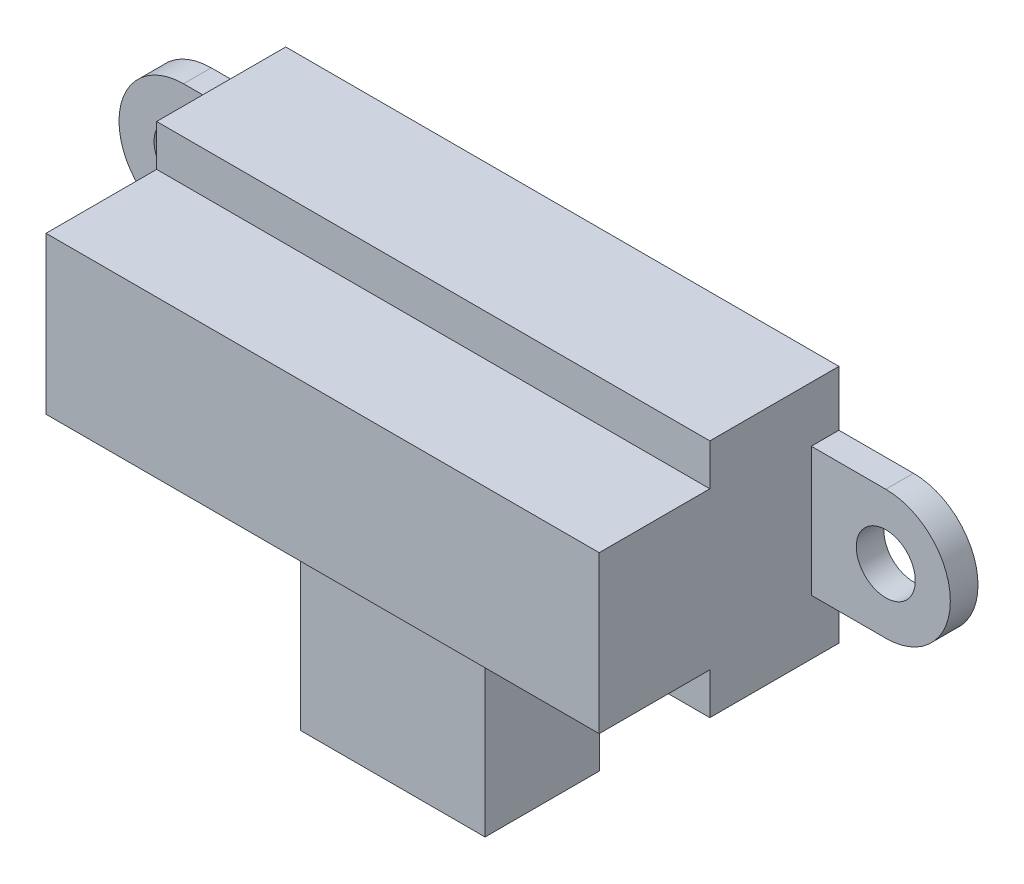
ISO-10303-21;
HEADER;
FILE_DESCRIPTION(('STEP AP214'),'2;1');
FILE_NAME('part.step','',(''),(''),'','','');
FILE_SCHEMA(('AUTOMOTIVE_DESIGN { 1 0 10303 214 1 1 1 1 }'));
ENDSEC;
DATA;
#1=APPLICATION_CONTEXT('core data for automotive mechanical design processes');
#2=APPLICATION_PROTOCOL_DEFINITION('international standard','automotive_design',2000,#1);
#3=PRODUCT_CONTEXT('',#1,'mechanical');
#4=PRODUCT('Part','Part','',(#3));
#5=PRODUCT_RELATED_PRODUCT_CATEGORY('part','',(#4));
#6=PRODUCT_DEFINITION_FORMATION('','',#4);
#7=PRODUCT_DEFINITION_CONTEXT('part definition',#1,'design');
#8=PRODUCT_DEFINITION('design','',#6,#7);
#9=PRODUCT_DEFINITION_SHAPE('','',#8);
#10=(LENGTH_UNIT() NAMED_UNIT(*) SI_UNIT(.MILLI.,.METRE.));
#11=(NAMED_UNIT(*) PLANE_ANGLE_UNIT() SI_UNIT($,.RADIAN.));
#12=(NAMED_UNIT(*) SI_UNIT($,.STERADIAN.) SOLID_ANGLE_UNIT());
#13=UNCERTAINTY_MEASURE_WITH_UNIT(LENGTH_MEASURE(1.E-05),#10,'distance_accuracy_value','');
#14=(GEOMETRIC_REPRESENTATION_CONTEXT(3) GLOBAL_UNCERTAINTY_ASSIGNED_CONTEXT((#13)) GLOBAL_UNIT_ASSIGNED_CONTEXT((#10,
#11,#12)) REPRESENTATION_CONTEXT('',''));
#15=CARTESIAN_POINT('',(0.,0.,0.));
#16=DIRECTION('',(0.,0.,1.));
#17=DIRECTION('',(1.,0.,0.));
#18=AXIS2_PLACEMENT_3D('',#15,#16,#17);
#19=CARTESIAN_POINT('',(3.7294903718985,-13.8810858102408,7.));
#20=DIRECTION('',(0.,0.,1.));
#21=DIRECTION('',(1.,0.,0.));
#22=AXIS2_PLACEMENT_3D('',#19,#20,#21);
#23=PLANE('',#22);
#24=DIRECTION('',(0.,-1.,0.));
#25=VECTOR('',#24,1.);
#26=CARTESIAN_POINT('',(9.51032870766269,-13.8810858102408,7.));
#27=LINE('',#26,#25);
#28=CARTESIAN_POINT('',(9.51032870766269,2.25,7.));
#29=VERTEX_POINT('',#28);
#30=CARTESIAN_POINT('',(9.51032870766269,0.,7.));
#31=VERTEX_POINT('',#30);
#32=EDGE_CURVE('E219',#29,#31,#27,.T.);
#33=ORIENTED_EDGE('',*,*,#32,.F.);
#34=DIRECTION('',(1.,0.,0.));
#35=VECTOR('',#34,1.);
#36=CARTESIAN_POINT('',(0.,2.25,7.));
#37=LINE('',#36,#35);
#38=CARTESIAN_POINT('',(0.,2.25,7.));
#39=VERTEX_POINT('',#38);
#40=EDGE_CURVE('E240',#39,#29,#37,.T.);
#41=ORIENTED_EDGE('',*,*,#40,.F.);
#42=DIRECTION('',(0.,1.,0.));
#43=VECTOR('',#42,1.);
#44=CARTESIAN_POINT('',(0.,-13.8810858102408,7.));
#45=LINE('',#44,#43);
#46=CARTESIAN_POINT('',(0.,0.,7.));
#47=VERTEX_POINT('',#46);
#48=EDGE_CURVE('E265',#47,#39,#45,.T.);
#49=ORIENTED_EDGE('',*,*,#48,.F.);
#50=DIRECTION('',(1.,0.,0.));
#51=VECTOR('',#50,1.);
#52=CARTESIAN_POINT('',(3.7294903718985,0.,7.));
#53=LINE('',#52,#51);
#54=EDGE_CURVE('E264',#47,#31,#53,.T.);
#55=ORIENTED_EDGE('',*,*,#54,.T.);
#56=EDGE_LOOP('',(#33,#41,#49,#55));
#57=FACE_BOUND('',#56,.T.);
#58=ADVANCED_FACE('F33',(#57),#23,.T.);
#59=DIRECTION('',(-1.,0.,0.));
#60=VECTOR('',#59,1.);
#61=CARTESIAN_POINT('',(0.,10.75,7.));
#62=LINE('',#61,#60);
#63=CARTESIAN_POINT('',(30.,10.75,7.));
#64=VERTEX_POINT('',#63);
#65=CARTESIAN_POINT('',(0.,10.75,7.));
#66=VERTEX_POINT('',#65);
#67=EDGE_CURVE('E227',#64,#66,#62,.T.);
#68=ORIENTED_EDGE('',*,*,#67,.F.);
#69=DIRECTION('',(0.,1.,0.));
#70=VECTOR('',#69,1.);
#71=CARTESIAN_POINT('',(30.,-13.8810858102408,7.));
#72=LINE('',#71,#70);
#73=CARTESIAN_POINT('',(30.,13.,7.));
#74=VERTEX_POINT('',#73);
#75=EDGE_CURVE('E285',#64,#74,#72,.T.);
#76=ORIENTED_EDGE('',*,*,#75,.T.);
#77=DIRECTION('',(1.,0.,0.));
#78=VECTOR('',#77,1.);
#79=CARTESIAN_POINT('',(3.7294903718985,13.,7.));
#80=LINE('',#79,#78);
#81=CARTESIAN_POINT('',(0.,13.,7.));
#82=VERTEX_POINT('',#81);
#83=EDGE_CURVE('E267',#82,#74,#80,.T.);
#84=ORIENTED_EDGE('',*,*,#83,.F.);
#85=EDGE_CURVE('E56',#66,#82,#45,.T.);
#86=ORIENTED_EDGE('',*,*,#85,.F.);
#87=EDGE_LOOP('',(#68,#76,#84,#86));
#88=FACE_BOUND('',#87,.T.);
#89=ADVANCED_FACE('F403',(#88),#23,.T.);
#90=CARTESIAN_POINT('',(30.,-13.8810858102408,7.));
#91=DIRECTION('',(-1.,0.,0.));
#92=DIRECTION('',(0.,-1.,0.));
#93=AXIS2_PLACEMENT_3D('',#90,#91,#92);
#94=PLANE('',#93);
#95=DIRECTION('',(0.,0.,-1.));
#96=VECTOR('',#95,1.);
#97=CARTESIAN_POINT('',(30.,3.,1.5));
#98=LINE('',#97,#96);
#99=CARTESIAN_POINT('',(30.,3.,1.5));
#100=VERTEX_POINT('',#99);
#101=CARTESIAN_POINT('',(30.,3.,0.));
#102=VERTEX_POINT('',#101);
#103=EDGE_CURVE('E714',#100,#102,#98,.T.);
#104=ORIENTED_EDGE('',*,*,#103,.F.);
#105=DIRECTION('',(0.,-1.,0.));
#106=VECTOR('',#105,1.);
#107=CARTESIAN_POINT('',(30.,-13.8810858102408,1.5));
#108=LINE('',#107,#106);
#109=CARTESIAN_POINT('',(30.,10.,1.5));
#110=VERTEX_POINT('',#109);
#111=EDGE_CURVE('E708',#110,#100,#108,.T.);
#112=ORIENTED_EDGE('',*,*,#111,.F.);
#113=DIRECTION('',(0.,0.,-1.));
#114=VECTOR('',#113,1.);
#115=CARTESIAN_POINT('',(30.,10.,1.5));
#116=LINE('',#115,#114);
#117=CARTESIAN_POINT('',(30.,10.,0.));
#118=VERTEX_POINT('',#117);
#119=EDGE_CURVE('E712',#110,#118,#116,.T.);
#120=ORIENTED_EDGE('',*,*,#119,.T.);
#121=DIRECTION('',(0.,1.,0.));
#122=VECTOR('',#121,1.);
#123=CARTESIAN_POINT('',(30.,-13.8810858102408,0.));
#124=LINE('',#123,#122);
#125=CARTESIAN_POINT('',(30.,13.,0.));
#126=VERTEX_POINT('',#125);
#127=EDGE_CURVE('E303',#118,#126,#124,.T.);
#128=ORIENTED_EDGE('',*,*,#127,.T.);
#129=DIRECTION('',(0.,0.,-1.));
#130=VECTOR('',#129,1.);
#131=CARTESIAN_POINT('',(30.,13.,7.));
#132=LINE('',#131,#130);
#133=EDGE_CURVE('E299',#74,#126,#132,.T.);
#134=ORIENTED_EDGE('',*,*,#133,.F.);
#135=ORIENTED_EDGE('',*,*,#75,.F.);
#136=DIRECTION('',(0.,0.,-1.));
#137=VECTOR('',#136,1.);
#138=CARTESIAN_POINT('',(30.,10.75,13.));
#139=LINE('',#138,#137);
#140=CARTESIAN_POINT('',(30.,10.75,13.));
#141=VERTEX_POINT('',#140);
#142=EDGE_CURVE('E430',#141,#64,#139,.T.);
#143=ORIENTED_EDGE('',*,*,#142,.F.);
#144=DIRECTION('',(0.,1.,0.));
#145=VECTOR('',#144,1.);
#146=CARTESIAN_POINT('',(30.,10.75,13.));
#147=LINE('',#146,#145);
#148=CARTESIAN_POINT('',(30.,2.25,13.));
#149=VERTEX_POINT('',#148);
#150=EDGE_CURVE('E229',#149,#141,#147,.T.);
#151=ORIENTED_EDGE('',*,*,#150,.F.);
#152=DIRECTION('',(0.,0.,-1.));
#153=VECTOR('',#152,1.);
#154=CARTESIAN_POINT('',(30.,2.25,13.));
#155=LINE('',#154,#153);
#156=CARTESIAN_POINT('',(30.,2.25,7.));
#157=VERTEX_POINT('',#156);
#158=EDGE_CURVE('E427',#149,#157,#155,.T.);
#159=ORIENTED_EDGE('',*,*,#158,.T.);
#160=CARTESIAN_POINT('',(30.,0.,7.));
#161=VERTEX_POINT('',#160);
#162=EDGE_CURVE('E288',#161,#157,#72,.T.);
#163=ORIENTED_EDGE('',*,*,#162,.F.);
#164=DIRECTION('',(0.,0.,-1.));
#165=VECTOR('',#164,1.);
#166=CARTESIAN_POINT('',(30.,0.,7.));
#167=LINE('',#166,#165);
#168=CARTESIAN_POINT('',(30.,0.,0.));
#169=VERTEX_POINT('',#168);
#170=EDGE_CURVE('E382',#161,#169,#167,.T.);
#171=ORIENTED_EDGE('',*,*,#170,.T.);
#172=EDGE_CURVE('E289',#169,#102,#124,.T.);
#173=ORIENTED_EDGE('',*,*,#172,.T.);
#174=EDGE_LOOP('',(#104,#112,#120,#128,#134,#135,#143,#151,#159,#163,#171,#173));
#175=FACE_BOUND('',#174,.T.);
#176=ADVANCED_FACE('F409',(#175),#94,.F.);
#177=CARTESIAN_POINT('',(3.7294903718985,0.,7.));
#178=DIRECTION('',(0.,1.,0.));
#179=DIRECTION('',(0.,0.,1.));
#180=AXIS2_PLACEMENT_3D('',#177,#178,#179);
#181=PLANE('',#180);
#182=DIRECTION('',(-1.,0.,0.));
#183=VECTOR('',#182,1.);
#184=CARTESIAN_POINT('',(3.7294903718985,0.,2.5));
#185=LINE('',#184,#183);
#186=CARTESIAN_POINT('',(19.5103287076627,0.,2.5));
#187=VERTEX_POINT('',#186);
#188=CARTESIAN_POINT('',(9.51032870766269,0.,2.5));
#189=VERTEX_POINT('',#188);
#190=EDGE_CURVE('E11',#187,#189,#185,.T.);
#191=ORIENTED_EDGE('',*,*,#190,.T.);
#192=DIRECTION('',(0.,0.,1.));
#193=VECTOR('',#192,1.);
#194=CARTESIAN_POINT('',(9.51032870766269,0.,7.));
#195=LINE('',#194,#193);
#196=EDGE_CURVE('E189',#189,#31,#195,.T.);
#197=ORIENTED_EDGE('',*,*,#196,.T.);
#198=ORIENTED_EDGE('',*,*,#54,.F.);
#199=DIRECTION('',(0.,0.,-1.));
#200=VECTOR('',#199,1.);
#201=CARTESIAN_POINT('',(0.,0.,7.));
#202=LINE('',#201,#200);
#203=CARTESIAN_POINT('',(0.,0.,0.));
#204=VERTEX_POINT('',#203);
#205=EDGE_CURVE('E284',#47,#204,#202,.T.);
#206=ORIENTED_EDGE('',*,*,#205,.T.);
#207=DIRECTION('',(1.,0.,0.));
#208=VECTOR('',#207,1.);
#209=CARTESIAN_POINT('',(3.7294903718985,0.,0.));
#210=LINE('',#209,#208);
#211=EDGE_CURVE('E279',#204,#169,#210,.T.);
#212=ORIENTED_EDGE('',*,*,#211,.T.);
#213=ORIENTED_EDGE('',*,*,#170,.F.);
#214=CARTESIAN_POINT('',(19.5103287076627,0.,7.));
#215=VERTEX_POINT('',#214);
#216=EDGE_CURVE('E268',#215,#161,#53,.T.);
#217=ORIENTED_EDGE('',*,*,#216,.F.);
#218=DIRECTION('',(0.,0.,-1.));
#219=VECTOR('',#218,1.);
#220=CARTESIAN_POINT('',(19.5103287076627,0.,7.));
#221=LINE('',#220,#219);
#222=EDGE_CURVE('E216',#215,#187,#221,.T.);
#223=ORIENTED_EDGE('',*,*,#222,.T.);
#224=EDGE_LOOP('',(#191,#197,#198,#206,#212,#213,#217,#223));
#225=FACE_BOUND('',#224,.T.);
#226=ADVANCED_FACE('F35',(#225),#181,.F.);
#227=CARTESIAN_POINT('',(3.7294903718985,13.,7.));
#228=DIRECTION('',(0.,1.,0.));
#229=DIRECTION('',(0.,0.,1.));
#230=AXIS2_PLACEMENT_3D('',#227,#228,#229);
#231=PLANE('',#230);
#232=DIRECTION('',(1.,0.,0.));
#233=VECTOR('',#232,1.);
#234=CARTESIAN_POINT('',(3.7294903718985,13.,0.));
#235=LINE('',#234,#233);
#236=CARTESIAN_POINT('',(0.,13.,0.));
#237=VERTEX_POINT('',#236);
#238=EDGE_CURVE('E337',#237,#126,#235,.T.);
#239=ORIENTED_EDGE('',*,*,#238,.F.);
#240=DIRECTION('',(0.,0.,-1.));
#241=VECTOR('',#240,1.);
#242=CARTESIAN_POINT('',(0.,13.,7.));
#243=LINE('',#242,#241);
#244=EDGE_CURVE('E251',#82,#237,#243,.T.);
#245=ORIENTED_EDGE('',*,*,#244,.F.);
#246=ORIENTED_EDGE('',*,*,#83,.T.);
#247=ORIENTED_EDGE('',*,*,#133,.T.);
#248=EDGE_LOOP('',(#239,#245,#246,#247));
#249=FACE_BOUND('',#248,.T.);
#250=ADVANCED_FACE('F418',(#249),#231,.T.);
#251=CARTESIAN_POINT('',(0.,-13.8810858102408,7.));
#252=DIRECTION('',(-1.,0.,0.));
#253=DIRECTION('',(0.,-1.,0.));
#254=AXIS2_PLACEMENT_3D('',#251,#252,#253);
#255=PLANE('',#254);
#256=DIRECTION('',(0.,0.,-1.));
#257=VECTOR('',#256,1.);
#258=CARTESIAN_POINT('',(0.,10.,1.5));
#259=LINE('',#258,#257);
#260=CARTESIAN_POINT('',(0.,10.,1.5));
#261=VERTEX_POINT('',#260);
#262=CARTESIAN_POINT('',(0.,10.,0.));
#263=VERTEX_POINT('',#262);
#264=EDGE_CURVE('E317',#261,#263,#259,.T.);
#265=ORIENTED_EDGE('',*,*,#264,.F.);
#266=DIRECTION('',(0.,-1.,0.));
#267=VECTOR('',#266,1.);
#268=CARTESIAN_POINT('',(0.,-13.8810858102408,1.5));
#269=LINE('',#268,#267);
#270=CARTESIAN_POINT('',(0.,3.,1.5));
#271=VERTEX_POINT('',#270);
#272=EDGE_CURVE('E320',#261,#271,#269,.T.);
#273=ORIENTED_EDGE('',*,*,#272,.T.);
#274=DIRECTION('',(0.,0.,-1.));
#275=VECTOR('',#274,1.);
#276=CARTESIAN_POINT('',(0.,3.,1.5));
#277=LINE('',#276,#275);
#278=CARTESIAN_POINT('',(0.,3.,0.));
#279=VERTEX_POINT('',#278);
#280=EDGE_CURVE('E319',#271,#279,#277,.T.);
#281=ORIENTED_EDGE('',*,*,#280,.T.);
#282=DIRECTION('',(0.,1.,0.));
#283=VECTOR('',#282,1.);
#284=CARTESIAN_POINT('',(0.,-13.8810858102408,0.));
#285=LINE('',#284,#283);
#286=EDGE_CURVE('E272',#204,#279,#285,.T.);
#287=ORIENTED_EDGE('',*,*,#286,.F.);
#288=ORIENTED_EDGE('',*,*,#205,.F.);
#289=ORIENTED_EDGE('',*,*,#48,.T.);
#290=DIRECTION('',(0.,0.,-1.));
#291=VECTOR('',#290,1.);
#292=CARTESIAN_POINT('',(0.,2.25,13.));
#293=LINE('',#292,#291);
#294=CARTESIAN_POINT('',(0.,2.25,13.));
#295=VERTEX_POINT('',#294);
#296=EDGE_CURVE('E429',#295,#39,#293,.T.);
#297=ORIENTED_EDGE('',*,*,#296,.F.);
#298=DIRECTION('',(0.,-1.,0.));
#299=VECTOR('',#298,1.);
#300=CARTESIAN_POINT('',(0.,10.75,13.));
#301=LINE('',#300,#299);
#302=CARTESIAN_POINT('',(0.,10.75,13.));
#303=VERTEX_POINT('',#302);
#304=EDGE_CURVE('E223',#303,#295,#301,.T.);
#305=ORIENTED_EDGE('',*,*,#304,.F.);
#306=DIRECTION('',(0.,0.,-1.));
#307=VECTOR('',#306,1.);
#308=CARTESIAN_POINT('',(0.,10.75,13.));
#309=LINE('',#308,#307);
#310=EDGE_CURVE('E233',#303,#66,#309,.T.);
#311=ORIENTED_EDGE('',*,*,#310,.T.);
#312=ORIENTED_EDGE('',*,*,#85,.T.);
#313=ORIENTED_EDGE('',*,*,#244,.T.);
#314=EDGE_CURVE('E342',#263,#237,#285,.T.);
#315=ORIENTED_EDGE('',*,*,#314,.F.);
#316=EDGE_LOOP('',(#265,#273,#281,#287,#288,#289,#297,#305,#311,#312,#313,#315));
#317=FACE_BOUND('',#316,.T.);
#318=ADVANCED_FACE('F365',(#317),#255,.T.);
#319=DIRECTION('',(0.,1.,0.));
#320=VECTOR('',#319,1.);
#321=CARTESIAN_POINT('',(19.5103287076627,-13.8810858102408,7.));
#322=LINE('',#321,#320);
#323=CARTESIAN_POINT('',(19.5103287076627,2.25,7.));
#324=VERTEX_POINT('',#323);
#325=EDGE_CURVE('E48',#215,#324,#322,.T.);
#326=ORIENTED_EDGE('',*,*,#325,.F.);
#327=ORIENTED_EDGE('',*,*,#216,.T.);
#328=ORIENTED_EDGE('',*,*,#162,.T.);
#329=EDGE_CURVE('E222',#324,#157,#37,.T.);
#330=ORIENTED_EDGE('',*,*,#329,.F.);
#331=EDGE_LOOP('',(#326,#327,#328,#330));
#332=FACE_BOUND('',#331,.T.);
#333=ADVANCED_FACE('F405',(#332),#23,.T.);
#334=CARTESIAN_POINT('',(3.7294903718985,-13.8810858102408,0.));
#335=DIRECTION('',(0.,0.,1.));
#336=DIRECTION('',(1.,0.,0.));
#337=AXIS2_PLACEMENT_3D('',#334,#335,#336);
#338=PLANE('',#337);
#339=ORIENTED_EDGE('',*,*,#211,.F.);
#340=ORIENTED_EDGE('',*,*,#286,.T.);
#341=DIRECTION('',(-1.,0.,0.));
#342=VECTOR('',#341,1.);
#343=CARTESIAN_POINT('',(3.7294903718985,3.,0.));
#344=LINE('',#343,#342);
#345=CARTESIAN_POINT('',(-4.041019256203,3.,0.));
#346=VERTEX_POINT('',#345);
#347=EDGE_CURVE('E371',#279,#346,#344,.T.);
#348=ORIENTED_EDGE('',*,*,#347,.T.);
#349=CARTESIAN_POINT('',(-4.041019256203,6.5,0.));
#350=DIRECTION('',(0.,0.,1.));
#351=DIRECTION('',(1.,0.,0.));
#352=AXIS2_PLACEMENT_3D('',#349,#350,#351);
#353=CIRCLE('',#352,3.5);
#354=CARTESIAN_POINT('',(-4.041019256203,10.,0.));
#355=VERTEX_POINT('',#354);
#356=EDGE_CURVE('E313',#355,#346,#353,.T.);
#357=ORIENTED_EDGE('',*,*,#356,.F.);
#358=DIRECTION('',(-1.,0.,0.));
#359=VECTOR('',#358,1.);
#360=CARTESIAN_POINT('',(3.7294903718985,10.,0.));
#361=LINE('',#360,#359);
#362=EDGE_CURVE('E310',#263,#355,#361,.T.);
#363=ORIENTED_EDGE('',*,*,#362,.F.);
#364=ORIENTED_EDGE('',*,*,#314,.T.);
#365=ORIENTED_EDGE('',*,*,#238,.T.);
#366=ORIENTED_EDGE('',*,*,#127,.F.);
#367=DIRECTION('',(1.,0.,0.));
#368=VECTOR('',#367,1.);
#369=CARTESIAN_POINT('',(26.2705096281015,10.,0.));
#370=LINE('',#369,#368);
#371=CARTESIAN_POINT('',(34.041019256203,10.,0.));
#372=VERTEX_POINT('',#371);
#373=EDGE_CURVE('E723',#118,#372,#370,.T.);
#374=ORIENTED_EDGE('',*,*,#373,.T.);
#375=CARTESIAN_POINT('',(34.041019256203,6.5,0.));
#376=DIRECTION('',(0.,0.,-1.));
#377=DIRECTION('',(-1.,0.,0.));
#378=AXIS2_PLACEMENT_3D('',#375,#376,#377);
#379=CIRCLE('',#378,3.5);
#380=CARTESIAN_POINT('',(34.041019256203,3.,0.));
#381=VERTEX_POINT('',#380);
#382=EDGE_CURVE('E724',#372,#381,#379,.T.);
#383=ORIENTED_EDGE('',*,*,#382,.T.);
#384=DIRECTION('',(1.,0.,0.));
#385=VECTOR('',#384,1.);
#386=CARTESIAN_POINT('',(26.2705096281015,3.,0.));
#387=LINE('',#386,#385);
#388=EDGE_CURVE('E727',#102,#381,#387,.T.);
#389=ORIENTED_EDGE('',*,*,#388,.F.);
#390=ORIENTED_EDGE('',*,*,#172,.F.);
#391=EDGE_LOOP('',(#339,#340,#348,#357,#363,#364,#365,#366,#374,#383,#389,#390));
#392=FACE_BOUND('',#391,.T.);
#393=CARTESIAN_POINT('',(-4.041019256203,6.5,0.));
#394=DIRECTION('',(0.,0.,1.));
#395=DIRECTION('',(1.,0.,0.));
#396=AXIS2_PLACEMENT_3D('',#393,#394,#395);
#397=CIRCLE('',#396,1.6);
#398=CARTESIAN_POINT('',(-2.441019256203,6.5,0.));
#399=VERTEX_POINT('',#398);
#400=EDGE_CURVE('E314',#399,#399,#397,.T.);
#401=ORIENTED_EDGE('',*,*,#400,.T.);
#402=EDGE_LOOP('',(#401));
#403=FACE_BOUND('',#402,.T.);
#404=CARTESIAN_POINT('',(34.041019256203,6.5,0.));
#405=DIRECTION('',(0.,0.,-1.));
#406=DIRECTION('',(-1.,0.,0.));
#407=AXIS2_PLACEMENT_3D('',#404,#405,#406);
#408=CIRCLE('',#407,1.6);
#409=CARTESIAN_POINT('',(32.441019256203,6.5,0.));
#410=VERTEX_POINT('',#409);
#411=EDGE_CURVE('E431',#410,#410,#408,.T.);
#412=ORIENTED_EDGE('',*,*,#411,.F.);
#413=EDGE_LOOP('',(#412));
#414=FACE_BOUND('',#413,.T.);
#415=ADVANCED_FACE('F361',(#392,#403,#414),#338,.F.);
#416=CARTESIAN_POINT('',(3.7294903718985,10.,1.5));
#417=DIRECTION('',(0.,-1.,0.));
#418=DIRECTION('',(0.,0.,-1.));
#419=AXIS2_PLACEMENT_3D('',#416,#417,#418);
#420=PLANE('',#419);
#421=ORIENTED_EDGE('',*,*,#362,.T.);
#422=DIRECTION('',(0.,0.,-1.));
#423=VECTOR('',#422,1.);
#424=CARTESIAN_POINT('',(-4.041019256203,10.,1.5));
#425=LINE('',#424,#423);
#426=CARTESIAN_POINT('',(-4.041019256203,10.,1.5));
#427=VERTEX_POINT('',#426);
#428=EDGE_CURVE('E274',#427,#355,#425,.T.);
#429=ORIENTED_EDGE('',*,*,#428,.F.);
#430=DIRECTION('',(-1.,0.,0.));
#431=VECTOR('',#430,1.);
#432=CARTESIAN_POINT('',(3.7294903718985,10.,1.5));
#433=LINE('',#432,#431);
#434=EDGE_CURVE('E378',#261,#427,#433,.T.);
#435=ORIENTED_EDGE('',*,*,#434,.F.);
#436=ORIENTED_EDGE('',*,*,#264,.T.);
#437=EDGE_LOOP('',(#421,#429,#435,#436));
#438=FACE_BOUND('',#437,.T.);
#439=ADVANCED_FACE('F390',(#438),#420,.F.);
#440=CARTESIAN_POINT('',(-4.041019256203,6.5,1.5));
#441=DIRECTION('',(0.,0.,-1.));
#442=DIRECTION('',(-1.,0.,0.));
#443=AXIS2_PLACEMENT_3D('',#440,#441,#442);
#444=CYLINDRICAL_SURFACE('',#443,3.5);
#445=ORIENTED_EDGE('',*,*,#356,.T.);
#446=DIRECTION('',(0.,0.,-1.));
#447=VECTOR('',#446,1.);
#448=CARTESIAN_POINT('',(-4.041019256203,3.,1.5));
#449=LINE('',#448,#447);
#450=CARTESIAN_POINT('',(-4.041019256203,3.,1.5));
#451=VERTEX_POINT('',#450);
#452=EDGE_CURVE('E324',#451,#346,#449,.T.);
#453=ORIENTED_EDGE('',*,*,#452,.F.);
#454=CARTESIAN_POINT('',(-4.041019256203,6.5,1.5));
#455=DIRECTION('',(0.,0.,1.));
#456=DIRECTION('',(1.,0.,0.));
#457=AXIS2_PLACEMENT_3D('',#454,#455,#456);
#458=CIRCLE('',#457,3.5);
#459=EDGE_CURVE('E375',#427,#451,#458,.T.);
#460=ORIENTED_EDGE('',*,*,#459,.F.);
#461=ORIENTED_EDGE('',*,*,#428,.T.);
#462=EDGE_LOOP('',(#445,#453,#460,#461));
#463=FACE_BOUND('',#462,.T.);
#464=ADVANCED_FACE('F392',(#463),#444,.T.);
#465=CARTESIAN_POINT('',(3.7294903718985,3.,1.5));
#466=DIRECTION('',(0.,-1.,0.));
#467=DIRECTION('',(1.,0.,0.));
#468=AXIS2_PLACEMENT_3D('',#465,#466,#467);
#469=PLANE('',#468);
#470=ORIENTED_EDGE('',*,*,#347,.F.);
#471=ORIENTED_EDGE('',*,*,#280,.F.);
#472=DIRECTION('',(-1.,0.,0.));
#473=VECTOR('',#472,1.);
#474=CARTESIAN_POINT('',(3.7294903718985,3.,1.5));
#475=LINE('',#474,#473);
#476=EDGE_CURVE('E370',#271,#451,#475,.T.);
#477=ORIENTED_EDGE('',*,*,#476,.T.);
#478=ORIENTED_EDGE('',*,*,#452,.T.);
#479=EDGE_LOOP('',(#470,#471,#477,#478));
#480=FACE_BOUND('',#479,.T.);
#481=ADVANCED_FACE('F369',(#480),#469,.T.);
#482=CARTESIAN_POINT('',(-4.041019256203,6.5,1.5));
#483=DIRECTION('',(0.,0.,-1.));
#484=DIRECTION('',(-1.,0.,0.));
#485=AXIS2_PLACEMENT_3D('',#482,#483,#484);
#486=CYLINDRICAL_SURFACE('',#485,1.6);
#487=CARTESIAN_POINT('',(-4.041019256203,6.5,1.5));
#488=DIRECTION('',(0.,0.,1.));
#489=DIRECTION('',(1.,0.,0.));
#490=AXIS2_PLACEMENT_3D('',#487,#488,#489);
#491=CIRCLE('',#490,1.6);
#492=CARTESIAN_POINT('',(-2.441019256203,6.5,1.5));
#493=VERTEX_POINT('',#492);
#494=EDGE_CURVE('E387',#493,#493,#491,.T.);
#495=ORIENTED_EDGE('',*,*,#494,.T.);
#496=EDGE_LOOP('',(#495));
#497=FACE_BOUND('',#496,.T.);
#498=ORIENTED_EDGE('',*,*,#400,.F.);
#499=EDGE_LOOP('',(#498));
#500=FACE_BOUND('',#499,.T.);
#501=ADVANCED_FACE('F399',(#497,#500),#486,.F.);
#502=CARTESIAN_POINT('',(3.7294903718985,-13.8810858102408,1.5));
#503=DIRECTION('',(0.,0.,1.));
#504=DIRECTION('',(1.,0.,0.));
#505=AXIS2_PLACEMENT_3D('',#502,#503,#504);
#506=PLANE('',#505);
#507=ORIENTED_EDGE('',*,*,#494,.F.);
#508=EDGE_LOOP('',(#507));
#509=FACE_BOUND('',#508,.T.);
#510=ORIENTED_EDGE('',*,*,#434,.T.);
#511=ORIENTED_EDGE('',*,*,#459,.T.);
#512=ORIENTED_EDGE('',*,*,#476,.F.);
#513=ORIENTED_EDGE('',*,*,#272,.F.);
#514=EDGE_LOOP('',(#510,#511,#512,#513));
#515=FACE_BOUND('',#514,.T.);
#516=ADVANCED_FACE('F374',(#509,#515),#506,.T.);
#517=CARTESIAN_POINT('',(26.2705096281015,10.,1.5));
#518=DIRECTION('',(0.,1.,0.));
#519=DIRECTION('',(0.,0.,1.));
#520=AXIS2_PLACEMENT_3D('',#517,#518,#519);
#521=PLANE('',#520);
#522=ORIENTED_EDGE('',*,*,#373,.F.);
#523=ORIENTED_EDGE('',*,*,#119,.F.);
#524=DIRECTION('',(1.,0.,0.));
#525=VECTOR('',#524,1.);
#526=CARTESIAN_POINT('',(26.2705096281015,10.,1.5));
#527=LINE('',#526,#525);
#528=CARTESIAN_POINT('',(34.041019256203,10.,1.5));
#529=VERTEX_POINT('',#528);
#530=EDGE_CURVE('E706',#110,#529,#527,.T.);
#531=ORIENTED_EDGE('',*,*,#530,.T.);
#532=DIRECTION('',(0.,0.,-1.));
#533=VECTOR('',#532,1.);
#534=CARTESIAN_POINT('',(34.041019256203,10.,1.5));
#535=LINE('',#534,#533);
#536=EDGE_CURVE('E720',#529,#372,#535,.T.);
#537=ORIENTED_EDGE('',*,*,#536,.T.);
#538=EDGE_LOOP('',(#522,#523,#531,#537));
#539=FACE_BOUND('',#538,.T.);
#540=ADVANCED_FACE('F468',(#539),#521,.T.);
#541=CARTESIAN_POINT('',(26.2705096281015,3.,1.5));
#542=DIRECTION('',(0.,1.,0.));
#543=DIRECTION('',(-1.,0.,0.));
#544=AXIS2_PLACEMENT_3D('',#541,#542,#543);
#545=PLANE('',#544);
#546=ORIENTED_EDGE('',*,*,#388,.T.);
#547=DIRECTION('',(0.,0.,-1.));
#548=VECTOR('',#547,1.);
#549=CARTESIAN_POINT('',(34.041019256203,3.,1.5));
#550=LINE('',#549,#548);
#551=CARTESIAN_POINT('',(34.041019256203,3.,1.5));
#552=VERTEX_POINT('',#551);
#553=EDGE_CURVE('E728',#552,#381,#550,.T.);
#554=ORIENTED_EDGE('',*,*,#553,.F.);
#555=DIRECTION('',(1.,0.,0.));
#556=VECTOR('',#555,1.);
#557=CARTESIAN_POINT('',(26.2705096281015,3.,1.5));
#558=LINE('',#557,#556);
#559=EDGE_CURVE('E715',#100,#552,#558,.T.);
#560=ORIENTED_EDGE('',*,*,#559,.F.);
#561=ORIENTED_EDGE('',*,*,#103,.T.);
#562=EDGE_LOOP('',(#546,#554,#560,#561));
#563=FACE_BOUND('',#562,.T.);
#564=ADVANCED_FACE('F474',(#563),#545,.F.);
#565=CARTESIAN_POINT('',(34.041019256203,6.5,1.5));
#566=DIRECTION('',(0.,0.,-1.));
#567=DIRECTION('',(-1.,0.,0.));
#568=AXIS2_PLACEMENT_3D('',#565,#566,#567);
#569=CYLINDRICAL_SURFACE('',#568,1.6);
#570=CARTESIAN_POINT('',(34.041019256203,6.5,1.5));
#571=DIRECTION('',(0.,0.,-1.));
#572=DIRECTION('',(-1.,0.,0.));
#573=AXIS2_PLACEMENT_3D('',#570,#571,#572);
#574=CIRCLE('',#573,1.6);
#575=CARTESIAN_POINT('',(32.441019256203,6.5,1.5));
#576=VERTEX_POINT('',#575);
#577=EDGE_CURVE('E701',#576,#576,#574,.T.);
#578=ORIENTED_EDGE('',*,*,#577,.F.);
#579=EDGE_LOOP('',(#578));
#580=FACE_BOUND('',#579,.T.);
#581=ORIENTED_EDGE('',*,*,#411,.T.);
#582=EDGE_LOOP('',(#581));
#583=FACE_BOUND('',#582,.T.);
#584=ADVANCED_FACE('F465',(#580,#583),#569,.F.);
#585=CARTESIAN_POINT('',(34.041019256203,6.5,1.5));
#586=DIRECTION('',(0.,0.,-1.));
#587=DIRECTION('',(-1.,0.,0.));
#588=AXIS2_PLACEMENT_3D('',#585,#586,#587);
#589=CYLINDRICAL_SURFACE('',#588,3.5);
#590=ORIENTED_EDGE('',*,*,#382,.F.);
#591=ORIENTED_EDGE('',*,*,#536,.F.);
#592=CARTESIAN_POINT('',(34.041019256203,6.5,1.5));
#593=DIRECTION('',(0.,0.,-1.));
#594=DIRECTION('',(-1.,0.,0.));
#595=AXIS2_PLACEMENT_3D('',#592,#593,#594);
#596=CIRCLE('',#595,3.5);
#597=EDGE_CURVE('E710',#529,#552,#596,.T.);
#598=ORIENTED_EDGE('',*,*,#597,.T.);
#599=ORIENTED_EDGE('',*,*,#553,.T.);
#600=EDGE_LOOP('',(#590,#591,#598,#599));
#601=FACE_BOUND('',#600,.T.);
#602=ADVANCED_FACE('F530',(#601),#589,.T.);
#603=CARTESIAN_POINT('',(26.2705096281015,-13.8810858102408,1.5));
#604=DIRECTION('',(0.,0.,1.));
#605=DIRECTION('',(-1.,0.,0.));
#606=AXIS2_PLACEMENT_3D('',#603,#604,#605);
#607=PLANE('',#606);
#608=ORIENTED_EDGE('',*,*,#577,.T.);
#609=EDGE_LOOP('',(#608));
#610=FACE_BOUND('',#609,.T.);
#611=ORIENTED_EDGE('',*,*,#530,.F.);
#612=ORIENTED_EDGE('',*,*,#111,.T.);
#613=ORIENTED_EDGE('',*,*,#559,.T.);
#614=ORIENTED_EDGE('',*,*,#597,.F.);
#615=EDGE_LOOP('',(#611,#612,#613,#614));
#616=FACE_BOUND('',#615,.T.);
#617=ADVANCED_FACE('F539',(#610,#616),#607,.T.);
#618=CARTESIAN_POINT('',(0.,2.25,13.));
#619=DIRECTION('',(0.,1.,0.));
#620=DIRECTION('',(0.,0.,1.));
#621=AXIS2_PLACEMENT_3D('',#618,#619,#620);
#622=PLANE('',#621);
#623=ORIENTED_EDGE('',*,*,#40,.T.);
#624=DIRECTION('',(0.,0.,1.));
#625=VECTOR('',#624,1.);
#626=CARTESIAN_POINT('',(9.51032870766269,2.25,13.));
#627=LINE('',#626,#625);
#628=CARTESIAN_POINT('',(9.51032870766269,2.25,8.7));
#629=VERTEX_POINT('',#628);
#630=EDGE_CURVE('E41',#29,#629,#627,.T.);
#631=ORIENTED_EDGE('',*,*,#630,.T.);
#632=DIRECTION('',(1.,0.,0.));
#633=VECTOR('',#632,1.);
#634=CARTESIAN_POINT('',(0.,2.25,8.7));
#635=LINE('',#634,#633);
#636=CARTESIAN_POINT('',(19.5103287076627,2.25,8.7));
#637=VERTEX_POINT('',#636);
#638=EDGE_CURVE('E250',#629,#637,#635,.T.);
#639=ORIENTED_EDGE('',*,*,#638,.T.);
#640=DIRECTION('',(0.,0.,-1.));
#641=VECTOR('',#640,1.);
#642=CARTESIAN_POINT('',(19.5103287076627,2.25,13.));
#643=LINE('',#642,#641);
#644=EDGE_CURVE('E248',#637,#324,#643,.T.);
#645=ORIENTED_EDGE('',*,*,#644,.T.);
#646=ORIENTED_EDGE('',*,*,#329,.T.);
#647=ORIENTED_EDGE('',*,*,#158,.F.);
#648=DIRECTION('',(1.,0.,0.));
#649=VECTOR('',#648,1.);
#650=CARTESIAN_POINT('',(0.,2.25,13.));
#651=LINE('',#650,#649);
#652=EDGE_CURVE('E226',#295,#149,#651,.T.);
#653=ORIENTED_EDGE('',*,*,#652,.F.);
#654=ORIENTED_EDGE('',*,*,#296,.T.);
#655=EDGE_LOOP('',(#623,#631,#639,#645,#646,#647,#653,#654));
#656=FACE_BOUND('',#655,.T.);
#657=ADVANCED_FACE('F256',(#656),#622,.F.);
#658=CARTESIAN_POINT('',(0.,10.75,13.));
#659=DIRECTION('',(0.,-1.,0.));
#660=DIRECTION('',(1.,0.,0.));
#661=AXIS2_PLACEMENT_3D('',#658,#659,#660);
#662=PLANE('',#661);
#663=ORIENTED_EDGE('',*,*,#67,.T.);
#664=ORIENTED_EDGE('',*,*,#310,.F.);
#665=DIRECTION('',(-1.,0.,0.));
#666=VECTOR('',#665,1.);
#667=CARTESIAN_POINT('',(0.,10.75,13.));
#668=LINE('',#667,#666);
#669=EDGE_CURVE('E231',#141,#303,#668,.T.);
#670=ORIENTED_EDGE('',*,*,#669,.F.);
#671=ORIENTED_EDGE('',*,*,#142,.T.);
#672=EDGE_LOOP('',(#663,#664,#670,#671));
#673=FACE_BOUND('',#672,.T.);
#674=ADVANCED_FACE('F448',(#673),#662,.F.);
#675=CARTESIAN_POINT('',(0.,2.25,13.));
#676=DIRECTION('',(0.,0.,1.));
#677=DIRECTION('',(1.,0.,0.));
#678=AXIS2_PLACEMENT_3D('',#675,#676,#677);
#679=PLANE('',#678);
#680=ORIENTED_EDGE('',*,*,#304,.T.);
#681=ORIENTED_EDGE('',*,*,#652,.T.);
#682=ORIENTED_EDGE('',*,*,#150,.T.);
#683=ORIENTED_EDGE('',*,*,#669,.T.);
#684=EDGE_LOOP('',(#680,#681,#682,#683));
#685=FACE_BOUND('',#684,.T.);
#686=ADVANCED_FACE('F578',(#685),#679,.T.);
#687=CARTESIAN_POINT('',(9.51032870766269,6.,2.5));
#688=DIRECTION('',(0.,0.,-1.));
#689=DIRECTION('',(-1.,0.,0.));
#690=AXIS2_PLACEMENT_3D('',#687,#688,#689);
#691=PLANE('',#690);
#692=ORIENTED_EDGE('',*,*,#190,.F.);
#693=DIRECTION('',(0.,-1.,0.));
#694=VECTOR('',#693,1.);
#695=CARTESIAN_POINT('',(19.5103287076627,6.,2.5));
#696=LINE('',#695,#694);
#697=CARTESIAN_POINT('',(19.5103287076627,-10.,2.5));
#698=VERTEX_POINT('',#697);
#699=EDGE_CURVE('E191',#187,#698,#696,.T.);
#700=ORIENTED_EDGE('',*,*,#699,.T.);
#701=DIRECTION('',(1.,0.,0.));
#702=VECTOR('',#701,1.);
#703=CARTESIAN_POINT('',(9.51032870766269,-10.,2.5));
#704=LINE('',#703,#702);
#705=CARTESIAN_POINT('',(9.51032870766269,-10.,2.5));
#706=VERTEX_POINT('',#705);
#707=EDGE_CURVE('E195',#706,#698,#704,.T.);
#708=ORIENTED_EDGE('',*,*,#707,.F.);
#709=DIRECTION('',(0.,-1.,0.));
#710=VECTOR('',#709,1.);
#711=CARTESIAN_POINT('',(9.51032870766269,6.,2.5));
#712=LINE('',#711,#710);
#713=EDGE_CURVE('E182',#189,#706,#712,.T.);
#714=ORIENTED_EDGE('',*,*,#713,.F.);
#715=EDGE_LOOP('',(#692,#700,#708,#714));
#716=FACE_BOUND('',#715,.T.);
#717=ADVANCED_FACE('F196',(#716),#691,.T.);
#718=CARTESIAN_POINT('',(9.51032870766269,6.,8.7));
#719=DIRECTION('',(-1.,0.,0.));
#720=DIRECTION('',(0.,0.,1.));
#721=AXIS2_PLACEMENT_3D('',#718,#719,#720);
#722=PLANE('',#721);
#723=ORIENTED_EDGE('',*,*,#196,.F.);
#724=ORIENTED_EDGE('',*,*,#713,.T.);
#725=DIRECTION('',(0.,0.,-1.));
#726=VECTOR('',#725,1.);
#727=CARTESIAN_POINT('',(9.51032870766269,-10.,8.7));
#728=LINE('',#727,#726);
#729=CARTESIAN_POINT('',(9.51032870766269,-10.,8.7));
#730=VERTEX_POINT('',#729);
#731=EDGE_CURVE('E187',#730,#706,#728,.T.);
#732=ORIENTED_EDGE('',*,*,#731,.F.);
#733=DIRECTION('',(0.,-1.,0.));
#734=VECTOR('',#733,1.);
#735=CARTESIAN_POINT('',(9.51032870766269,6.,8.7));
#736=LINE('',#735,#734);
#737=EDGE_CURVE('E210',#629,#730,#736,.T.);
#738=ORIENTED_EDGE('',*,*,#737,.F.);
#739=ORIENTED_EDGE('',*,*,#630,.F.);
#740=ORIENTED_EDGE('',*,*,#32,.T.);
#741=EDGE_LOOP('',(#723,#724,#732,#738,#739,#740));
#742=FACE_BOUND('',#741,.T.);
#743=ADVANCED_FACE('F184',(#742),#722,.T.);
#744=CARTESIAN_POINT('',(9.51032870766269,6.,8.7));
#745=DIRECTION('',(0.,0.,1.));
#746=DIRECTION('',(1.,0.,0.));
#747=AXIS2_PLACEMENT_3D('',#744,#745,#746);
#748=PLANE('',#747);
#749=ORIENTED_EDGE('',*,*,#638,.F.);
#750=ORIENTED_EDGE('',*,*,#737,.T.);
#751=DIRECTION('',(-1.,0.,0.));
#752=VECTOR('',#751,1.);
#753=CARTESIAN_POINT('',(9.51032870766269,-10.,8.7));
#754=LINE('',#753,#752);
#755=CARTESIAN_POINT('',(19.5103287076627,-10.,8.7));
#756=VERTEX_POINT('',#755);
#757=EDGE_CURVE('E192',#756,#730,#754,.T.);
#758=ORIENTED_EDGE('',*,*,#757,.F.);
#759=DIRECTION('',(0.,-1.,0.));
#760=VECTOR('',#759,1.);
#761=CARTESIAN_POINT('',(19.5103287076627,6.,8.7));
#762=LINE('',#761,#760);
#763=EDGE_CURVE('E212',#637,#756,#762,.T.);
#764=ORIENTED_EDGE('',*,*,#763,.F.);
#765=EDGE_LOOP('',(#749,#750,#758,#764));
#766=FACE_BOUND('',#765,.T.);
#767=ADVANCED_FACE('F626',(#766),#748,.T.);
#768=CARTESIAN_POINT('',(19.5103287076627,6.,8.7));
#769=DIRECTION('',(1.,0.,0.));
#770=DIRECTION('',(0.,0.,-1.));
#771=AXIS2_PLACEMENT_3D('',#768,#769,#770);
#772=PLANE('',#771);
#773=ORIENTED_EDGE('',*,*,#222,.F.);
#774=ORIENTED_EDGE('',*,*,#325,.T.);
#775=ORIENTED_EDGE('',*,*,#644,.F.);
#776=ORIENTED_EDGE('',*,*,#763,.T.);
#777=DIRECTION('',(0.,0.,1.));
#778=VECTOR('',#777,1.);
#779=CARTESIAN_POINT('',(19.5103287076627,-10.,8.7));
#780=LINE('',#779,#778);
#781=EDGE_CURVE('E201',#698,#756,#780,.T.);
#782=ORIENTED_EDGE('',*,*,#781,.F.);
#783=ORIENTED_EDGE('',*,*,#699,.F.);
#784=EDGE_LOOP('',(#773,#774,#775,#776,#782,#783));
#785=FACE_BOUND('',#784,.T.);
#786=ADVANCED_FACE('F635',(#785),#772,.T.);
#787=CARTESIAN_POINT('',(9.51032870766269,-10.,2.5));
#788=DIRECTION('',(0.,-1.,0.));
#789=DIRECTION('',(0.,0.,-1.));
#790=AXIS2_PLACEMENT_3D('',#787,#788,#789);
#791=PLANE('',#790);
#792=ORIENTED_EDGE('',*,*,#731,.T.);
#793=ORIENTED_EDGE('',*,*,#707,.T.);
#794=ORIENTED_EDGE('',*,*,#781,.T.);
#795=ORIENTED_EDGE('',*,*,#757,.T.);
#796=EDGE_LOOP('',(#792,#793,#794,#795));
#797=FACE_BOUND('',#796,.T.);
#798=ADVANCED_FACE('F204',(#797),#791,.T.);
#799=CLOSED_SHELL('',(#58,#89,#176,#226,#250,#318,#333,#415,#439,#464,#481,#501,#516,#540,#564,
#584,#602,#617,#657,#674,#686,#717,#743,#767,#786,#798));
#800=MANIFOLD_SOLID_BREP('B2',#799);
#801=ADVANCED_BREP_SHAPE_REPRESENTATION('',(#18,#800),#14);
#802=SHAPE_DEFINITION_REPRESENTATION(#9,#801);
ENDSEC;
END-ISO-10303-21;
